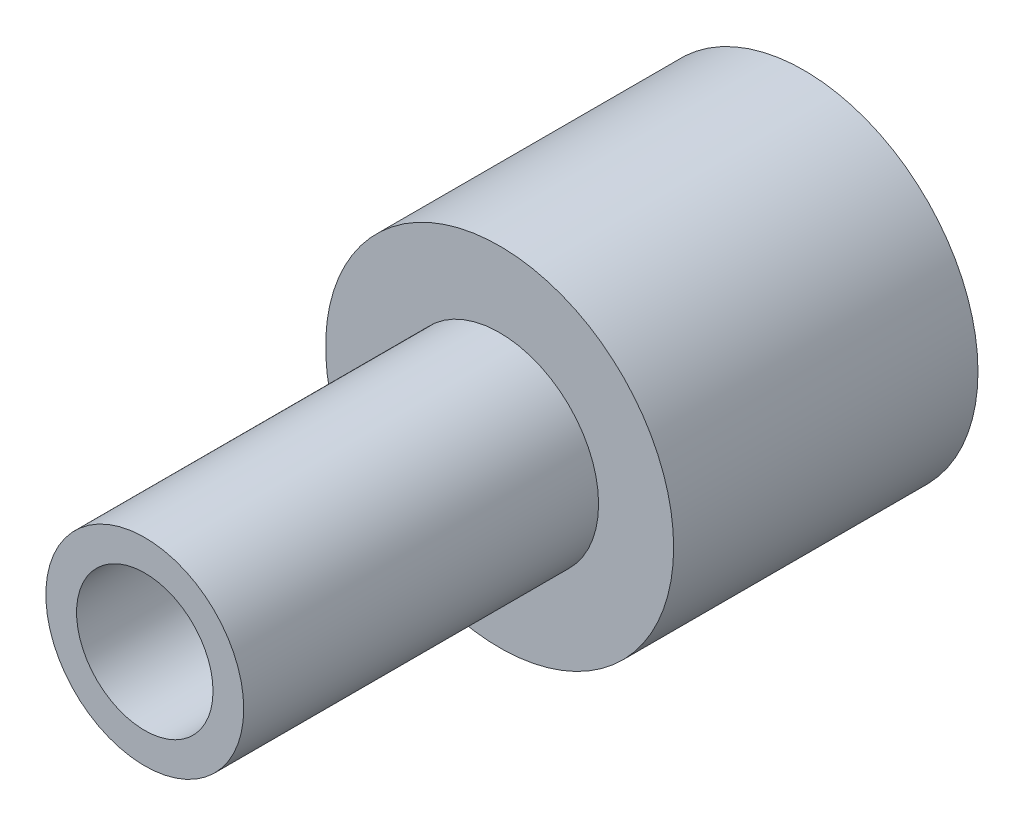
ISO-10303-21;
HEADER;
FILE_DESCRIPTION(('STEP AP214'),'2;1');
FILE_NAME('part.step','',(''),(''),'','','');
FILE_SCHEMA(('AUTOMOTIVE_DESIGN { 1 0 10303 214 1 1 1 1 }'));
ENDSEC;
DATA;
#1=APPLICATION_CONTEXT('core data for automotive mechanical design processes');
#2=APPLICATION_PROTOCOL_DEFINITION('international standard','automotive_design',2000,#1);
#3=PRODUCT_CONTEXT('',#1,'mechanical');
#4=PRODUCT('Part','Part','',(#3));
#5=PRODUCT_RELATED_PRODUCT_CATEGORY('part','',(#4));
#6=PRODUCT_DEFINITION_FORMATION('','',#4);
#7=PRODUCT_DEFINITION_CONTEXT('part definition',#1,'design');
#8=PRODUCT_DEFINITION('design','',#6,#7);
#9=PRODUCT_DEFINITION_SHAPE('','',#8);
#10=(LENGTH_UNIT() NAMED_UNIT(*) SI_UNIT(.MILLI.,.METRE.));
#11=(NAMED_UNIT(*) PLANE_ANGLE_UNIT() SI_UNIT($,.RADIAN.));
#12=(NAMED_UNIT(*) SI_UNIT($,.STERADIAN.) SOLID_ANGLE_UNIT());
#13=UNCERTAINTY_MEASURE_WITH_UNIT(LENGTH_MEASURE(1.E-05),#10,'distance_accuracy_value','');
#14=(GEOMETRIC_REPRESENTATION_CONTEXT(3) GLOBAL_UNCERTAINTY_ASSIGNED_CONTEXT((#13)) GLOBAL_UNIT_ASSIGNED_CONTEXT((#10,
#11,#12)) REPRESENTATION_CONTEXT('',''));
#15=CARTESIAN_POINT('',(0.,0.,0.));
#16=DIRECTION('',(0.,0.,1.));
#17=DIRECTION('',(1.,0.,0.));
#18=AXIS2_PLACEMENT_3D('',#15,#16,#17);
#19=CARTESIAN_POINT('',(0.,0.,0.));
#20=DIRECTION('',(0.,0.,1.));
#21=DIRECTION('',(1.,0.,0.));
#22=AXIS2_PLACEMENT_3D('',#19,#20,#21);
#23=PLANE('',#22);
#24=CARTESIAN_POINT('',(0.,0.,0.));
#25=DIRECTION('',(0.,0.,1.));
#26=DIRECTION('',(1.,0.,0.));
#27=AXIS2_PLACEMENT_3D('',#24,#25,#26);
#28=CIRCLE('',#27,0.6477);
#29=CARTESIAN_POINT('',(0.647700000000002,0.,0.));
#30=VERTEX_POINT('',#29);
#31=EDGE_CURVE('E46',#30,#30,#28,.T.);
#32=ORIENTED_EDGE('',*,*,#31,.T.);
#33=EDGE_LOOP('',(#32));
#34=FACE_BOUND('',#33,.T.);
#35=CARTESIAN_POINT('',(0.,0.,0.));
#36=DIRECTION('',(0.,0.,1.));
#37=DIRECTION('',(1.,0.,0.));
#38=AXIS2_PLACEMENT_3D('',#35,#36,#37);
#39=CIRCLE('',#38,0.3683);
#40=CARTESIAN_POINT('',(0.368300000000001,0.,0.));
#41=VERTEX_POINT('',#40);
#42=EDGE_CURVE('E61',#41,#41,#39,.T.);
#43=ORIENTED_EDGE('',*,*,#42,.F.);
#44=EDGE_LOOP('',(#43));
#45=FACE_BOUND('',#44,.T.);
#46=ADVANCED_FACE('F42',(#34,#45),#23,.T.);
#47=CARTESIAN_POINT('',(0.,0.,-1.13284));
#48=DIRECTION('',(0.,0.,1.));
#49=DIRECTION('',(1.,0.,0.));
#50=AXIS2_PLACEMENT_3D('',#47,#48,#49);
#51=CYLINDRICAL_SURFACE('',#50,0.6477);
#52=CARTESIAN_POINT('',(0.,0.,-1.13284));
#53=DIRECTION('',(0.,0.,1.));
#54=DIRECTION('',(1.,0.,0.));
#55=AXIS2_PLACEMENT_3D('',#52,#53,#54);
#56=CIRCLE('',#55,0.6477);
#57=CARTESIAN_POINT('',(0.647700000000002,0.,-1.13284));
#58=VERTEX_POINT('',#57);
#59=EDGE_CURVE('E10',#58,#58,#56,.T.);
#60=ORIENTED_EDGE('',*,*,#59,.T.);
#61=EDGE_LOOP('',(#60));
#62=FACE_BOUND('',#61,.T.);
#63=ORIENTED_EDGE('',*,*,#31,.F.);
#64=EDGE_LOOP('',(#63));
#65=FACE_BOUND('',#64,.T.);
#66=ADVANCED_FACE('F44',(#62,#65),#51,.T.);
#67=CARTESIAN_POINT('',(0.,0.,-1.13284));
#68=DIRECTION('',(0.,0.,1.));
#69=DIRECTION('',(1.,0.,0.));
#70=AXIS2_PLACEMENT_3D('',#67,#68,#69);
#71=PLANE('',#70);
#72=CARTESIAN_POINT('',(0.,0.,-1.13284));
#73=DIRECTION('',(0.,0.,1.));
#74=DIRECTION('',(1.,0.,0.));
#75=AXIS2_PLACEMENT_3D('',#72,#73,#74);
#76=CIRCLE('',#75,0.254);
#77=CARTESIAN_POINT('',(0.254000000000001,0.,-1.13284));
#78=VERTEX_POINT('',#77);
#79=EDGE_CURVE('E55',#78,#78,#76,.T.);
#80=ORIENTED_EDGE('',*,*,#79,.T.);
#81=EDGE_LOOP('',(#80));
#82=FACE_BOUND('',#81,.T.);
#83=ORIENTED_EDGE('',*,*,#59,.F.);
#84=EDGE_LOOP('',(#83));
#85=FACE_BOUND('',#84,.T.);
#86=ADVANCED_FACE('F79',(#82,#85),#71,.F.);
#87=CARTESIAN_POINT('',(0.,0.,-1.13284));
#88=DIRECTION('',(0.,0.,1.));
#89=DIRECTION('',(1.,0.,0.));
#90=AXIS2_PLACEMENT_3D('',#87,#88,#89);
#91=CYLINDRICAL_SURFACE('',#90,0.254);
#92=ORIENTED_EDGE('',*,*,#79,.F.);
#93=EDGE_LOOP('',(#92));
#94=FACE_BOUND('',#93,.T.);
#95=CARTESIAN_POINT('',(0.,0.,1.3208));
#96=DIRECTION('',(0.,0.,1.));
#97=DIRECTION('',(1.,0.,0.));
#98=AXIS2_PLACEMENT_3D('',#95,#96,#97);
#99=CIRCLE('',#98,0.254);
#100=CARTESIAN_POINT('',(0.254000000000001,0.,1.3208));
#101=VERTEX_POINT('',#100);
#102=EDGE_CURVE('E65',#101,#101,#99,.F.);
#103=ORIENTED_EDGE('',*,*,#102,.F.);
#104=EDGE_LOOP('',(#103));
#105=FACE_BOUND('',#104,.T.);
#106=ADVANCED_FACE('F76',(#94,#105),#91,.F.);
#107=CARTESIAN_POINT('',(0.,0.,1.3208));
#108=DIRECTION('',(0.,0.,-1.));
#109=DIRECTION('',(-1.,0.,0.));
#110=AXIS2_PLACEMENT_3D('',#107,#108,#109);
#111=CYLINDRICAL_SURFACE('',#110,0.3683);
#112=CARTESIAN_POINT('',(0.,0.,1.3208));
#113=DIRECTION('',(0.,0.,1.));
#114=DIRECTION('',(1.,0.,0.));
#115=AXIS2_PLACEMENT_3D('',#112,#113,#114);
#116=CIRCLE('',#115,0.3683);
#117=CARTESIAN_POINT('',(0.368300000000001,0.,1.3208));
#118=VERTEX_POINT('',#117);
#119=EDGE_CURVE('E60',#118,#118,#116,.T.);
#120=ORIENTED_EDGE('',*,*,#119,.F.);
#121=EDGE_LOOP('',(#120));
#122=FACE_BOUND('',#121,.T.);
#123=ORIENTED_EDGE('',*,*,#42,.T.);
#124=EDGE_LOOP('',(#123));
#125=FACE_BOUND('',#124,.T.);
#126=ADVANCED_FACE('F78',(#122,#125),#111,.T.);
#127=CARTESIAN_POINT('',(0.,0.,1.3208));
#128=DIRECTION('',(0.,0.,1.));
#129=DIRECTION('',(1.,0.,0.));
#130=AXIS2_PLACEMENT_3D('',#127,#128,#129);
#131=PLANE('',#130);
#132=ORIENTED_EDGE('',*,*,#102,.T.);
#133=EDGE_LOOP('',(#132));
#134=FACE_BOUND('',#133,.T.);
#135=ORIENTED_EDGE('',*,*,#119,.T.);
#136=EDGE_LOOP('',(#135));
#137=FACE_BOUND('',#136,.T.);
#138=ADVANCED_FACE('F73',(#134,#137),#131,.T.);
#139=CLOSED_SHELL('',(#46,#66,#86,#106,#126,#138));
#140=MANIFOLD_SOLID_BREP('B2',#139);
#141=ADVANCED_BREP_SHAPE_REPRESENTATION('',(#18,#140),#14);
#142=SHAPE_DEFINITION_REPRESENTATION(#9,#141);
ENDSEC;
END-ISO-10303-21;
